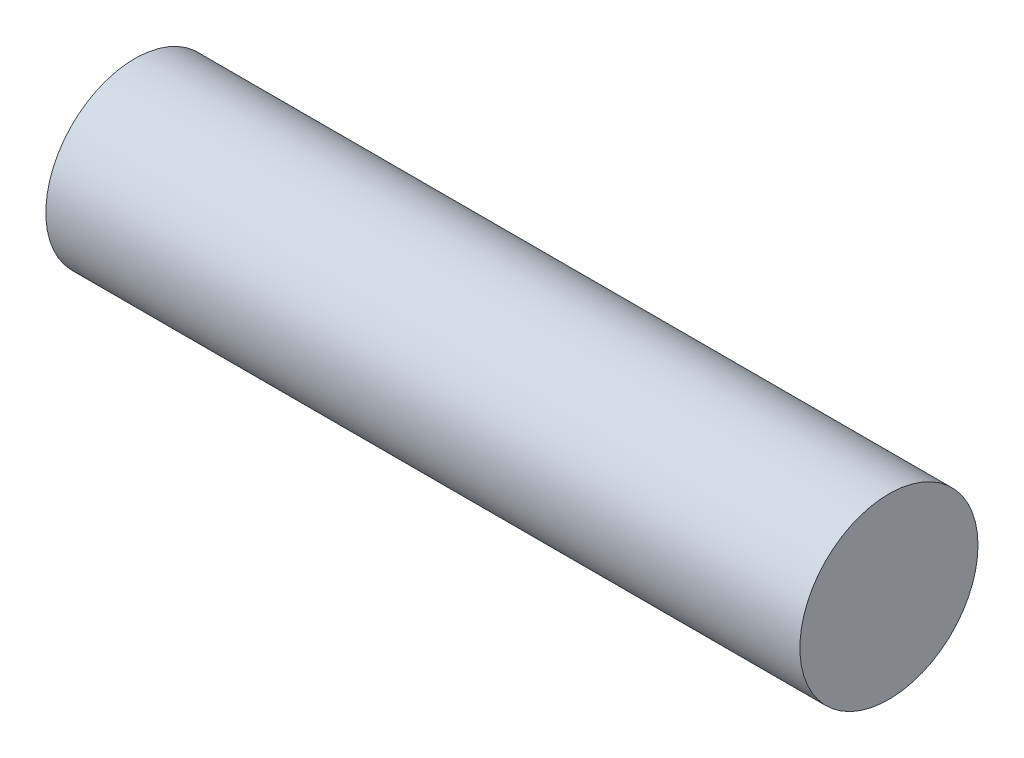
ISO-10303-21;
HEADER;
FILE_DESCRIPTION(('STEP AP214'),'2;1');
FILE_NAME('part.step','',(''),(''),'','','');
FILE_SCHEMA(('AUTOMOTIVE_DESIGN { 1 0 10303 214 1 1 1 1 }'));
ENDSEC;
DATA;
#1=APPLICATION_CONTEXT('core data for automotive mechanical design processes');
#2=APPLICATION_PROTOCOL_DEFINITION('international standard','automotive_design',2000,#1);
#3=PRODUCT_CONTEXT('',#1,'mechanical');
#4=PRODUCT('Part','Part','',(#3));
#5=PRODUCT_RELATED_PRODUCT_CATEGORY('part','',(#4));
#6=PRODUCT_DEFINITION_FORMATION('','',#4);
#7=PRODUCT_DEFINITION_CONTEXT('part definition',#1,'design');
#8=PRODUCT_DEFINITION('design','',#6,#7);
#9=PRODUCT_DEFINITION_SHAPE('','',#8);
#10=(LENGTH_UNIT() NAMED_UNIT(*) SI_UNIT(.MILLI.,.METRE.));
#11=(NAMED_UNIT(*) PLANE_ANGLE_UNIT() SI_UNIT($,.RADIAN.));
#12=(NAMED_UNIT(*) SI_UNIT($,.STERADIAN.) SOLID_ANGLE_UNIT());
#13=UNCERTAINTY_MEASURE_WITH_UNIT(LENGTH_MEASURE(1.E-05),#10,'distance_accuracy_value','');
#14=(GEOMETRIC_REPRESENTATION_CONTEXT(3) GLOBAL_UNCERTAINTY_ASSIGNED_CONTEXT((#13)) GLOBAL_UNIT_ASSIGNED_CONTEXT((#10,
#11,#12)) REPRESENTATION_CONTEXT('',''));
#15=CARTESIAN_POINT('',(0.,0.,0.));
#16=DIRECTION('',(0.,0.,1.));
#17=DIRECTION('',(1.,0.,0.));
#18=AXIS2_PLACEMENT_3D('',#15,#16,#17);
#19=CARTESIAN_POINT('',(25.4,0.,0.));
#20=DIRECTION('',(-1.,0.,0.));
#21=DIRECTION('',(0.,0.,1.));
#22=AXIS2_PLACEMENT_3D('',#19,#20,#21);
#23=CYLINDRICAL_SURFACE('',#22,3.);
#24=CARTESIAN_POINT('',(25.4,0.,0.));
#25=DIRECTION('',(1.,0.,0.));
#26=DIRECTION('',(0.,0.,-1.));
#27=AXIS2_PLACEMENT_3D('',#24,#25,#26);
#28=CIRCLE('',#27,3.);
#29=CARTESIAN_POINT('',(25.4,0.,-3.));
#30=VERTEX_POINT('',#29);
#31=EDGE_CURVE('E10',#30,#30,#28,.T.);
#32=ORIENTED_EDGE('',*,*,#31,.F.);
#33=EDGE_LOOP('',(#32));
#34=FACE_BOUND('',#33,.T.);
#35=CARTESIAN_POINT('',(0.,0.,0.));
#36=DIRECTION('',(1.,0.,0.));
#37=DIRECTION('',(0.,0.,-1.));
#38=AXIS2_PLACEMENT_3D('',#35,#36,#37);
#39=CIRCLE('',#38,3.);
#40=CARTESIAN_POINT('',(0.,0.,-3.));
#41=VERTEX_POINT('',#40);
#42=EDGE_CURVE('E46',#41,#41,#39,.T.);
#43=ORIENTED_EDGE('',*,*,#42,.T.);
#44=EDGE_LOOP('',(#43));
#45=FACE_BOUND('',#44,.T.);
#46=ADVANCED_FACE('F43',(#34,#45),#23,.T.);
#47=CARTESIAN_POINT('',(25.4,0.,0.));
#48=DIRECTION('',(1.,0.,0.));
#49=DIRECTION('',(0.,0.,-1.));
#50=AXIS2_PLACEMENT_3D('',#47,#48,#49);
#51=PLANE('',#50);
#52=ORIENTED_EDGE('',*,*,#31,.T.);
#53=EDGE_LOOP('',(#52));
#54=FACE_BOUND('',#53,.T.);
#55=ADVANCED_FACE('F58',(#54),#51,.T.);
#56=CARTESIAN_POINT('',(0.,0.,0.));
#57=DIRECTION('',(1.,0.,0.));
#58=DIRECTION('',(0.,0.,-1.));
#59=AXIS2_PLACEMENT_3D('',#56,#57,#58);
#60=PLANE('',#59);
#61=ORIENTED_EDGE('',*,*,#42,.F.);
#62=EDGE_LOOP('',(#61));
#63=FACE_BOUND('',#62,.T.);
#64=ADVANCED_FACE('F59',(#63),#60,.F.);
#65=CLOSED_SHELL('',(#46,#55,#64));
#66=MANIFOLD_SOLID_BREP('B2',#65);
#67=ADVANCED_BREP_SHAPE_REPRESENTATION('',(#18,#66),#14);
#68=SHAPE_DEFINITION_REPRESENTATION(#9,#67);
ENDSEC;
END-ISO-10303-21;
